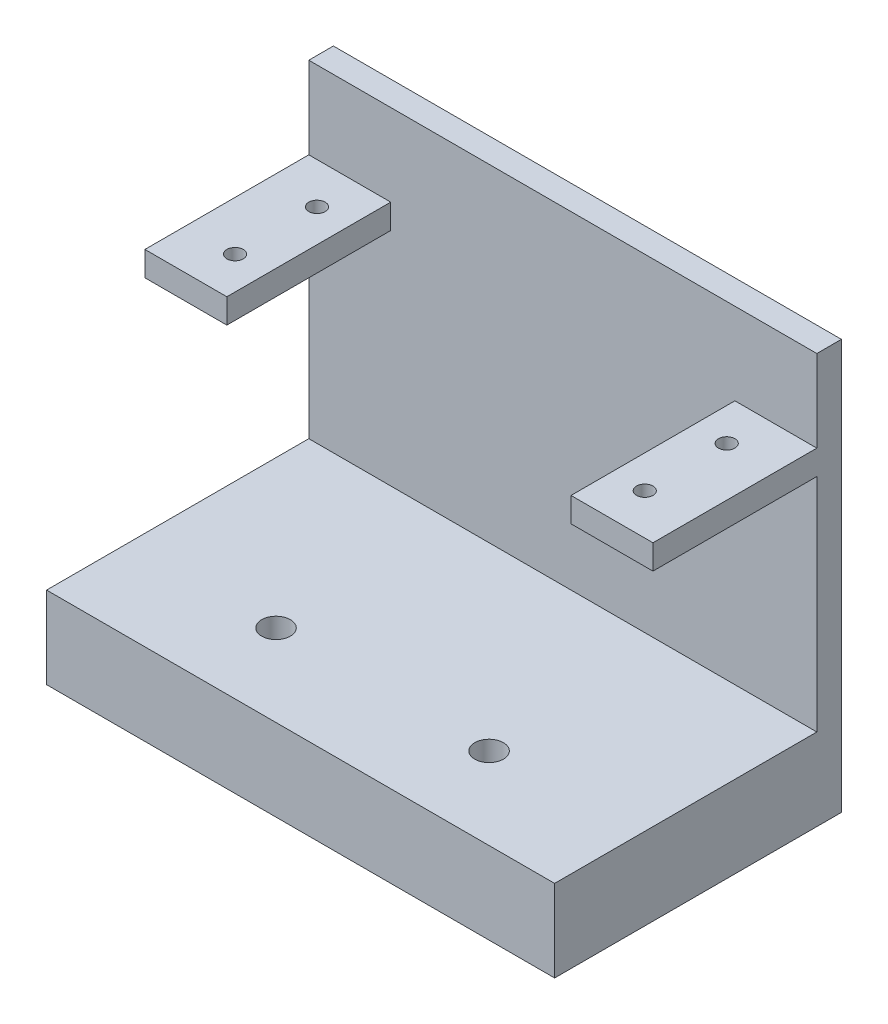
ISO-10303-21;
HEADER;
FILE_DESCRIPTION(('STEP AP214'),'2;1');
FILE_NAME('part.step','',(''),(''),'','','');
FILE_SCHEMA(('AUTOMOTIVE_DESIGN { 1 0 10303 214 1 1 1 1 }'));
ENDSEC;
DATA;
#1=APPLICATION_CONTEXT('core data for automotive mechanical design processes');
#2=APPLICATION_PROTOCOL_DEFINITION('international standard','automotive_design',2000,#1);
#3=PRODUCT_CONTEXT('',#1,'mechanical');
#4=PRODUCT('Part','Part','',(#3));
#5=PRODUCT_RELATED_PRODUCT_CATEGORY('part','',(#4));
#6=PRODUCT_DEFINITION_FORMATION('','',#4);
#7=PRODUCT_DEFINITION_CONTEXT('part definition',#1,'design');
#8=PRODUCT_DEFINITION('design','',#6,#7);
#9=PRODUCT_DEFINITION_SHAPE('','',#8);
#10=(LENGTH_UNIT() NAMED_UNIT(*) SI_UNIT(.MILLI.,.METRE.));
#11=(NAMED_UNIT(*) PLANE_ANGLE_UNIT() SI_UNIT($,.RADIAN.));
#12=(NAMED_UNIT(*) SI_UNIT($,.STERADIAN.) SOLID_ANGLE_UNIT());
#13=UNCERTAINTY_MEASURE_WITH_UNIT(LENGTH_MEASURE(1.E-05),#10,'distance_accuracy_value','');
#14=(GEOMETRIC_REPRESENTATION_CONTEXT(3) GLOBAL_UNCERTAINTY_ASSIGNED_CONTEXT((#13)) GLOBAL_UNIT_ASSIGNED_CONTEXT((#10,
#11,#12)) REPRESENTATION_CONTEXT('',''));
#15=CARTESIAN_POINT('',(0.,0.,0.));
#16=DIRECTION('',(0.,0.,1.));
#17=DIRECTION('',(1.,0.,0.));
#18=AXIS2_PLACEMENT_3D('',#15,#16,#17);
#19=CARTESIAN_POINT('',(0.,40.,-12.));
#20=DIRECTION('',(0.,-1.,0.));
#21=DIRECTION('',(0.,0.,-1.));
#22=AXIS2_PLACEMENT_3D('',#19,#20,#21);
#23=PLANE('',#22);
#24=CARTESIAN_POINT('',(6.,40.,-17.));
#25=DIRECTION('',(0.,1.,0.));
#26=DIRECTION('',(0.,0.,1.));
#27=AXIS2_PLACEMENT_3D('',#24,#25,#26);
#28=CIRCLE('',#27,1.);
#29=CARTESIAN_POINT('',(6.,40.,-16.));
#30=VERTEX_POINT('',#29);
#31=EDGE_CURVE('E280',#30,#30,#28,.T.);
#32=ORIENTED_EDGE('',*,*,#31,.F.);
#33=EDGE_LOOP('',(#32));
#34=FACE_BOUND('',#33,.T.);
#35=CARTESIAN_POINT('',(6.,40.,-27.));
#36=DIRECTION('',(0.,1.,0.));
#37=DIRECTION('',(0.,0.,1.));
#38=AXIS2_PLACEMENT_3D('',#35,#36,#37);
#39=CIRCLE('',#38,1.);
#40=CARTESIAN_POINT('',(6.,40.,-26.));
#41=VERTEX_POINT('',#40);
#42=EDGE_CURVE('E274',#41,#41,#39,.T.);
#43=ORIENTED_EDGE('',*,*,#42,.F.);
#44=EDGE_LOOP('',(#43));
#45=FACE_BOUND('',#44,.T.);
#46=DIRECTION('',(0.,0.,1.));
#47=VECTOR('',#46,1.);
#48=CARTESIAN_POINT('',(10.,40.,-12.));
#49=LINE('',#48,#47);
#50=CARTESIAN_POINT('',(10.,40.,-32.));
#51=VERTEX_POINT('',#50);
#52=CARTESIAN_POINT('',(10.,40.,-12.));
#53=VERTEX_POINT('',#52);
#54=EDGE_CURVE('E134',#51,#53,#49,.T.);
#55=ORIENTED_EDGE('',*,*,#54,.F.);
#56=DIRECTION('',(1.,0.,0.));
#57=VECTOR('',#56,1.);
#58=CARTESIAN_POINT('',(0.,40.,-32.));
#59=LINE('',#58,#57);
#60=CARTESIAN_POINT('',(0.,40.,-32.));
#61=VERTEX_POINT('',#60);
#62=EDGE_CURVE('E145',#61,#51,#59,.T.);
#63=ORIENTED_EDGE('',*,*,#62,.F.);
#64=DIRECTION('',(0.,0.,-1.));
#65=VECTOR('',#64,1.);
#66=CARTESIAN_POINT('',(0.,40.,-12.));
#67=LINE('',#66,#65);
#68=CARTESIAN_POINT('',(0.,40.,-12.));
#69=VERTEX_POINT('',#68);
#70=EDGE_CURVE('E241',#69,#61,#67,.T.);
#71=ORIENTED_EDGE('',*,*,#70,.F.);
#72=DIRECTION('',(1.,0.,0.));
#73=VECTOR('',#72,1.);
#74=CARTESIAN_POINT('',(0.,40.,-12.));
#75=LINE('',#74,#73);
#76=EDGE_CURVE('E147',#69,#53,#75,.T.);
#77=ORIENTED_EDGE('',*,*,#76,.T.);
#78=EDGE_LOOP('',(#55,#63,#71,#77));
#79=FACE_BOUND('',#78,.T.);
#80=ADVANCED_FACE('F34',(#34,#45,#79),#23,.F.);
#81=CARTESIAN_POINT('',(56.,40.,-27.));
#82=DIRECTION('',(0.,1.,0.));
#83=DIRECTION('',(0.,0.,1.));
#84=AXIS2_PLACEMENT_3D('',#81,#82,#83);
#85=CIRCLE('',#84,0.999999999999998);
#86=CARTESIAN_POINT('',(56.,40.,-26.));
#87=VERTEX_POINT('',#86);
#88=EDGE_CURVE('E292',#87,#87,#85,.T.);
#89=ORIENTED_EDGE('',*,*,#88,.F.);
#90=EDGE_LOOP('',(#89));
#91=FACE_BOUND('',#90,.T.);
#92=CARTESIAN_POINT('',(56.,40.,-17.));
#93=DIRECTION('',(0.,1.,0.));
#94=DIRECTION('',(0.,0.,1.));
#95=AXIS2_PLACEMENT_3D('',#92,#93,#94);
#96=CIRCLE('',#95,0.999999999999998);
#97=CARTESIAN_POINT('',(56.,40.,-16.));
#98=VERTEX_POINT('',#97);
#99=EDGE_CURVE('E286',#98,#98,#96,.T.);
#100=ORIENTED_EDGE('',*,*,#99,.F.);
#101=EDGE_LOOP('',(#100));
#102=FACE_BOUND('',#101,.T.);
#103=DIRECTION('',(0.,0.,-1.));
#104=VECTOR('',#103,1.);
#105=CARTESIAN_POINT('',(52.,40.,-12.));
#106=LINE('',#105,#104);
#107=CARTESIAN_POINT('',(52.,40.,-12.));
#108=VERTEX_POINT('',#107);
#109=CARTESIAN_POINT('',(52.,40.,-32.));
#110=VERTEX_POINT('',#109);
#111=EDGE_CURVE('E252',#108,#110,#106,.T.);
#112=ORIENTED_EDGE('',*,*,#111,.F.);
#113=CARTESIAN_POINT('',(62.,40.,-12.));
#114=VERTEX_POINT('',#113);
#115=EDGE_CURVE('E161',#108,#114,#75,.T.);
#116=ORIENTED_EDGE('',*,*,#115,.T.);
#117=DIRECTION('',(0.,0.,-1.));
#118=VECTOR('',#117,1.);
#119=CARTESIAN_POINT('',(62.,40.,-12.));
#120=LINE('',#119,#118);
#121=CARTESIAN_POINT('',(62.,40.,-32.));
#122=VERTEX_POINT('',#121);
#123=EDGE_CURVE('E223',#114,#122,#120,.T.);
#124=ORIENTED_EDGE('',*,*,#123,.T.);
#125=EDGE_CURVE('E154',#110,#122,#59,.T.);
#126=ORIENTED_EDGE('',*,*,#125,.F.);
#127=EDGE_LOOP('',(#112,#116,#124,#126));
#128=FACE_BOUND('',#127,.T.);
#129=ADVANCED_FACE('F321',(#91,#102,#128),#23,.F.);
#130=CARTESIAN_POINT('',(0.,37.,-12.));
#131=DIRECTION('',(0.,0.,-1.));
#132=DIRECTION('',(-1.,0.,0.));
#133=AXIS2_PLACEMENT_3D('',#130,#131,#132);
#134=PLANE('',#133);
#135=DIRECTION('',(0.,-1.,0.));
#136=VECTOR('',#135,1.);
#137=CARTESIAN_POINT('',(10.,50.,-12.));
#138=LINE('',#137,#136);
#139=CARTESIAN_POINT('',(10.,37.,-12.));
#140=VERTEX_POINT('',#139);
#141=EDGE_CURVE('E256',#53,#140,#138,.T.);
#142=ORIENTED_EDGE('',*,*,#141,.F.);
#143=ORIENTED_EDGE('',*,*,#76,.F.);
#144=DIRECTION('',(0.,1.,0.));
#145=VECTOR('',#144,1.);
#146=CARTESIAN_POINT('',(0.,37.,-12.));
#147=LINE('',#146,#145);
#148=CARTESIAN_POINT('',(0.,37.,-12.));
#149=VERTEX_POINT('',#148);
#150=EDGE_CURVE('E243',#149,#69,#147,.T.);
#151=ORIENTED_EDGE('',*,*,#150,.F.);
#152=DIRECTION('',(1.,0.,0.));
#153=VECTOR('',#152,1.);
#154=CARTESIAN_POINT('',(0.,37.,-12.));
#155=LINE('',#154,#153);
#156=EDGE_CURVE('E162',#149,#140,#155,.T.);
#157=ORIENTED_EDGE('',*,*,#156,.T.);
#158=EDGE_LOOP('',(#142,#143,#151,#157));
#159=FACE_BOUND('',#158,.T.);
#160=ADVANCED_FACE('F323',(#159),#134,.F.);
#161=DIRECTION('',(0.,-1.,0.));
#162=VECTOR('',#161,1.);
#163=CARTESIAN_POINT('',(52.,50.,-12.));
#164=LINE('',#163,#162);
#165=CARTESIAN_POINT('',(52.,37.,-12.));
#166=VERTEX_POINT('',#165);
#167=EDGE_CURVE('E258',#108,#166,#164,.T.);
#168=ORIENTED_EDGE('',*,*,#167,.T.);
#169=CARTESIAN_POINT('',(62.,37.,-12.));
#170=VERTEX_POINT('',#169);
#171=EDGE_CURVE('E165',#166,#170,#155,.T.);
#172=ORIENTED_EDGE('',*,*,#171,.T.);
#173=DIRECTION('',(0.,1.,0.));
#174=VECTOR('',#173,1.);
#175=CARTESIAN_POINT('',(62.,37.,-12.));
#176=LINE('',#175,#174);
#177=EDGE_CURVE('E228',#170,#114,#176,.T.);
#178=ORIENTED_EDGE('',*,*,#177,.T.);
#179=ORIENTED_EDGE('',*,*,#115,.F.);
#180=EDGE_LOOP('',(#168,#172,#178,#179));
#181=FACE_BOUND('',#180,.T.);
#182=ADVANCED_FACE('F317',(#181),#134,.F.);
#183=CARTESIAN_POINT('',(0.,37.,-32.));
#184=DIRECTION('',(0.,1.,0.));
#185=DIRECTION('',(0.,0.,1.));
#186=AXIS2_PLACEMENT_3D('',#183,#184,#185);
#187=PLANE('',#186);
#188=CARTESIAN_POINT('',(6.,37.,-17.));
#189=DIRECTION('',(0.,1.,0.));
#190=DIRECTION('',(0.,0.,1.));
#191=AXIS2_PLACEMENT_3D('',#188,#189,#190);
#192=CIRCLE('',#191,1.);
#193=CARTESIAN_POINT('',(6.,37.,-16.));
#194=VERTEX_POINT('',#193);
#195=EDGE_CURVE('E277',#194,#194,#192,.F.);
#196=ORIENTED_EDGE('',*,*,#195,.F.);
#197=EDGE_LOOP('',(#196));
#198=FACE_BOUND('',#197,.T.);
#199=CARTESIAN_POINT('',(6.,37.,-27.));
#200=DIRECTION('',(0.,1.,0.));
#201=DIRECTION('',(0.,0.,1.));
#202=AXIS2_PLACEMENT_3D('',#199,#200,#201);
#203=CIRCLE('',#202,1.);
#204=CARTESIAN_POINT('',(6.,37.,-26.));
#205=VERTEX_POINT('',#204);
#206=EDGE_CURVE('E273',#205,#205,#203,.F.);
#207=ORIENTED_EDGE('',*,*,#206,.F.);
#208=EDGE_LOOP('',(#207));
#209=FACE_BOUND('',#208,.T.);
#210=DIRECTION('',(0.,0.,-1.));
#211=VECTOR('',#210,1.);
#212=CARTESIAN_POINT('',(10.,37.,-32.));
#213=LINE('',#212,#211);
#214=CARTESIAN_POINT('',(10.,37.,-32.));
#215=VERTEX_POINT('',#214);
#216=EDGE_CURVE('E137',#140,#215,#213,.T.);
#217=ORIENTED_EDGE('',*,*,#216,.F.);
#218=ORIENTED_EDGE('',*,*,#156,.F.);
#219=DIRECTION('',(0.,0.,1.));
#220=VECTOR('',#219,1.);
#221=CARTESIAN_POINT('',(0.,37.,-32.));
#222=LINE('',#221,#220);
#223=CARTESIAN_POINT('',(0.,37.,-32.));
#224=VERTEX_POINT('',#223);
#225=EDGE_CURVE('E246',#224,#149,#222,.T.);
#226=ORIENTED_EDGE('',*,*,#225,.F.);
#227=DIRECTION('',(1.,0.,0.));
#228=VECTOR('',#227,1.);
#229=CARTESIAN_POINT('',(0.,37.,-32.));
#230=LINE('',#229,#228);
#231=EDGE_CURVE('E166',#224,#215,#230,.T.);
#232=ORIENTED_EDGE('',*,*,#231,.T.);
#233=EDGE_LOOP('',(#217,#218,#226,#232));
#234=FACE_BOUND('',#233,.T.);
#235=ADVANCED_FACE('F303',(#198,#209,#234),#187,.F.);
#236=CARTESIAN_POINT('',(56.,37.,-27.));
#237=DIRECTION('',(0.,1.,0.));
#238=DIRECTION('',(0.,0.,1.));
#239=AXIS2_PLACEMENT_3D('',#236,#237,#238);
#240=CIRCLE('',#239,0.999999999999998);
#241=CARTESIAN_POINT('',(56.,37.,-26.));
#242=VERTEX_POINT('',#241);
#243=EDGE_CURVE('E289',#242,#242,#240,.F.);
#244=ORIENTED_EDGE('',*,*,#243,.F.);
#245=EDGE_LOOP('',(#244));
#246=FACE_BOUND('',#245,.T.);
#247=CARTESIAN_POINT('',(56.,37.,-17.));
#248=DIRECTION('',(0.,1.,0.));
#249=DIRECTION('',(0.,0.,1.));
#250=AXIS2_PLACEMENT_3D('',#247,#248,#249);
#251=CIRCLE('',#250,0.999999999999998);
#252=CARTESIAN_POINT('',(56.,37.,-16.));
#253=VERTEX_POINT('',#252);
#254=EDGE_CURVE('E283',#253,#253,#251,.F.);
#255=ORIENTED_EDGE('',*,*,#254,.F.);
#256=EDGE_LOOP('',(#255));
#257=FACE_BOUND('',#256,.T.);
#258=DIRECTION('',(0.,0.,1.));
#259=VECTOR('',#258,1.);
#260=CARTESIAN_POINT('',(52.,37.,-32.));
#261=LINE('',#260,#259);
#262=CARTESIAN_POINT('',(52.,37.,-32.));
#263=VERTEX_POINT('',#262);
#264=EDGE_CURVE('E254',#263,#166,#261,.T.);
#265=ORIENTED_EDGE('',*,*,#264,.F.);
#266=CARTESIAN_POINT('',(62.,37.,-32.));
#267=VERTEX_POINT('',#266);
#268=EDGE_CURVE('E168',#263,#267,#230,.T.);
#269=ORIENTED_EDGE('',*,*,#268,.T.);
#270=DIRECTION('',(0.,0.,1.));
#271=VECTOR('',#270,1.);
#272=CARTESIAN_POINT('',(62.,37.,-32.));
#273=LINE('',#272,#271);
#274=EDGE_CURVE('E233',#267,#170,#273,.T.);
#275=ORIENTED_EDGE('',*,*,#274,.T.);
#276=ORIENTED_EDGE('',*,*,#171,.F.);
#277=EDGE_LOOP('',(#265,#269,#275,#276));
#278=FACE_BOUND('',#277,.T.);
#279=ADVANCED_FACE('F300',(#246,#257,#278),#187,.F.);
#280=CARTESIAN_POINT('',(0.,50.,0.));
#281=DIRECTION('',(1.,0.,0.));
#282=DIRECTION('',(0.,0.,-1.));
#283=AXIS2_PLACEMENT_3D('',#280,#281,#282);
#284=PLANE('',#283);
#285=ORIENTED_EDGE('',*,*,#70,.T.);
#286=DIRECTION('',(0.,1.,0.));
#287=VECTOR('',#286,1.);
#288=CARTESIAN_POINT('',(0.,40.,-32.));
#289=LINE('',#288,#287);
#290=CARTESIAN_POINT('',(0.,50.,-32.));
#291=VERTEX_POINT('',#290);
#292=EDGE_CURVE('E152',#61,#291,#289,.T.);
#293=ORIENTED_EDGE('',*,*,#292,.T.);
#294=DIRECTION('',(0.,0.,1.));
#295=VECTOR('',#294,1.);
#296=CARTESIAN_POINT('',(0.,50.,0.));
#297=LINE('',#296,#295);
#298=CARTESIAN_POINT('',(0.,50.,-35.));
#299=VERTEX_POINT('',#298);
#300=EDGE_CURVE('E173',#299,#291,#297,.T.);
#301=ORIENTED_EDGE('',*,*,#300,.F.);
#302=DIRECTION('',(0.,-1.,0.));
#303=VECTOR('',#302,1.);
#304=CARTESIAN_POINT('',(0.,50.,-35.));
#305=LINE('',#304,#303);
#306=CARTESIAN_POINT('',(0.,0.,-35.));
#307=VERTEX_POINT('',#306);
#308=EDGE_CURVE('E180',#299,#307,#305,.T.);
#309=ORIENTED_EDGE('',*,*,#308,.T.);
#310=DIRECTION('',(0.,0.,1.));
#311=VECTOR('',#310,1.);
#312=CARTESIAN_POINT('',(0.,0.,0.));
#313=LINE('',#312,#311);
#314=CARTESIAN_POINT('',(0.,0.,0.));
#315=VERTEX_POINT('',#314);
#316=EDGE_CURVE('E156',#307,#315,#313,.T.);
#317=ORIENTED_EDGE('',*,*,#316,.T.);
#318=DIRECTION('',(0.,-1.,0.));
#319=VECTOR('',#318,1.);
#320=CARTESIAN_POINT('',(0.,50.,0.));
#321=LINE('',#320,#319);
#322=CARTESIAN_POINT('',(0.,10.,0.));
#323=VERTEX_POINT('',#322);
#324=EDGE_CURVE('E11',#323,#315,#321,.T.);
#325=ORIENTED_EDGE('',*,*,#324,.F.);
#326=DIRECTION('',(0.,0.,-1.));
#327=VECTOR('',#326,1.);
#328=CARTESIAN_POINT('',(0.,10.,0.));
#329=LINE('',#328,#327);
#330=CARTESIAN_POINT('',(0.,10.,-32.));
#331=VERTEX_POINT('',#330);
#332=EDGE_CURVE('E224',#323,#331,#329,.T.);
#333=ORIENTED_EDGE('',*,*,#332,.T.);
#334=DIRECTION('',(0.,1.,0.));
#335=VECTOR('',#334,1.);
#336=CARTESIAN_POINT('',(0.,37.,-32.));
#337=LINE('',#336,#335);
#338=EDGE_CURVE('E226',#331,#224,#337,.T.);
#339=ORIENTED_EDGE('',*,*,#338,.T.);
#340=ORIENTED_EDGE('',*,*,#225,.T.);
#341=ORIENTED_EDGE('',*,*,#150,.T.);
#342=EDGE_LOOP('',(#285,#293,#301,#309,#317,#325,#333,#339,#340,#341));
#343=FACE_BOUND('',#342,.T.);
#344=ADVANCED_FACE('F36',(#343),#284,.F.);
#345=CARTESIAN_POINT('',(0.,50.,0.));
#346=DIRECTION('',(0.,0.,-1.));
#347=DIRECTION('',(-1.,0.,0.));
#348=AXIS2_PLACEMENT_3D('',#345,#346,#347);
#349=PLANE('',#348);
#350=DIRECTION('',(0.,-1.,0.));
#351=VECTOR('',#350,1.);
#352=CARTESIAN_POINT('',(62.,50.,0.));
#353=LINE('',#352,#351);
#354=CARTESIAN_POINT('',(62.,10.,0.));
#355=VERTEX_POINT('',#354);
#356=CARTESIAN_POINT('',(62.,0.,0.));
#357=VERTEX_POINT('',#356);
#358=EDGE_CURVE('E42',#355,#357,#353,.T.);
#359=ORIENTED_EDGE('',*,*,#358,.F.);
#360=DIRECTION('',(1.,0.,0.));
#361=VECTOR('',#360,1.);
#362=CARTESIAN_POINT('',(0.,10.,0.));
#363=LINE('',#362,#361);
#364=EDGE_CURVE('E171',#323,#355,#363,.T.);
#365=ORIENTED_EDGE('',*,*,#364,.F.);
#366=ORIENTED_EDGE('',*,*,#324,.T.);
#367=DIRECTION('',(1.,0.,0.));
#368=VECTOR('',#367,1.);
#369=CARTESIAN_POINT('',(0.,0.,0.));
#370=LINE('',#369,#368);
#371=EDGE_CURVE('E183',#315,#357,#370,.T.);
#372=ORIENTED_EDGE('',*,*,#371,.T.);
#373=EDGE_LOOP('',(#359,#365,#366,#372));
#374=FACE_BOUND('',#373,.T.);
#375=ADVANCED_FACE('F205',(#374),#349,.F.);
#376=CARTESIAN_POINT('',(62.,50.,0.));
#377=DIRECTION('',(-1.,0.,0.));
#378=DIRECTION('',(0.,0.,1.));
#379=AXIS2_PLACEMENT_3D('',#376,#377,#378);
#380=PLANE('',#379);
#381=DIRECTION('',(0.,0.,-1.));
#382=VECTOR('',#381,1.);
#383=CARTESIAN_POINT('',(62.,50.,0.));
#384=LINE('',#383,#382);
#385=CARTESIAN_POINT('',(62.,50.,-32.));
#386=VERTEX_POINT('',#385);
#387=CARTESIAN_POINT('',(62.,50.,-35.));
#388=VERTEX_POINT('',#387);
#389=EDGE_CURVE('E175',#386,#388,#384,.T.);
#390=ORIENTED_EDGE('',*,*,#389,.F.);
#391=DIRECTION('',(0.,1.,0.));
#392=VECTOR('',#391,1.);
#393=CARTESIAN_POINT('',(62.,40.,-32.));
#394=LINE('',#393,#392);
#395=EDGE_CURVE('E220',#122,#386,#394,.T.);
#396=ORIENTED_EDGE('',*,*,#395,.F.);
#397=ORIENTED_EDGE('',*,*,#123,.F.);
#398=ORIENTED_EDGE('',*,*,#177,.F.);
#399=ORIENTED_EDGE('',*,*,#274,.F.);
#400=DIRECTION('',(0.,1.,0.));
#401=VECTOR('',#400,1.);
#402=CARTESIAN_POINT('',(62.,37.,-32.));
#403=LINE('',#402,#401);
#404=CARTESIAN_POINT('',(62.,10.,-32.));
#405=VERTEX_POINT('',#404);
#406=EDGE_CURVE('E236',#405,#267,#403,.T.);
#407=ORIENTED_EDGE('',*,*,#406,.F.);
#408=DIRECTION('',(0.,0.,-1.));
#409=VECTOR('',#408,1.);
#410=CARTESIAN_POINT('',(62.,10.,0.));
#411=LINE('',#410,#409);
#412=EDGE_CURVE('E148',#355,#405,#411,.T.);
#413=ORIENTED_EDGE('',*,*,#412,.F.);
#414=ORIENTED_EDGE('',*,*,#358,.T.);
#415=DIRECTION('',(0.,0.,-1.));
#416=VECTOR('',#415,1.);
#417=CARTESIAN_POINT('',(62.,0.,0.));
#418=LINE('',#417,#416);
#419=CARTESIAN_POINT('',(62.,0.,-35.));
#420=VERTEX_POINT('',#419);
#421=EDGE_CURVE('E186',#357,#420,#418,.T.);
#422=ORIENTED_EDGE('',*,*,#421,.T.);
#423=DIRECTION('',(0.,-1.,0.));
#424=VECTOR('',#423,1.);
#425=CARTESIAN_POINT('',(62.,50.,-35.));
#426=LINE('',#425,#424);
#427=EDGE_CURVE('E191',#388,#420,#426,.T.);
#428=ORIENTED_EDGE('',*,*,#427,.F.);
#429=EDGE_LOOP('',(#390,#396,#397,#398,#399,#407,#413,#414,#422,#428));
#430=FACE_BOUND('',#429,.T.);
#431=ADVANCED_FACE('F197',(#430),#380,.F.);
#432=CARTESIAN_POINT('',(0.,50.,-35.));
#433=DIRECTION('',(0.,0.,1.));
#434=DIRECTION('',(1.,0.,0.));
#435=AXIS2_PLACEMENT_3D('',#432,#433,#434);
#436=PLANE('',#435);
#437=DIRECTION('',(-1.,0.,0.));
#438=VECTOR('',#437,1.);
#439=CARTESIAN_POINT('',(0.,0.,-35.));
#440=LINE('',#439,#438);
#441=EDGE_CURVE('E176',#420,#307,#440,.T.);
#442=ORIENTED_EDGE('',*,*,#441,.T.);
#443=ORIENTED_EDGE('',*,*,#308,.F.);
#444=DIRECTION('',(-1.,0.,0.));
#445=VECTOR('',#444,1.);
#446=CARTESIAN_POINT('',(0.,50.,-35.));
#447=LINE('',#446,#445);
#448=EDGE_CURVE('E178',#388,#299,#447,.T.);
#449=ORIENTED_EDGE('',*,*,#448,.F.);
#450=ORIENTED_EDGE('',*,*,#427,.T.);
#451=EDGE_LOOP('',(#442,#443,#449,#450));
#452=FACE_BOUND('',#451,.T.);
#453=ADVANCED_FACE('F213',(#452),#436,.F.);
#454=CARTESIAN_POINT('',(0.,50.,-35.));
#455=DIRECTION('',(0.,-1.,0.));
#456=DIRECTION('',(0.,0.,-1.));
#457=AXIS2_PLACEMENT_3D('',#454,#455,#456);
#458=PLANE('',#457);
#459=ORIENTED_EDGE('',*,*,#300,.T.);
#460=DIRECTION('',(1.,0.,0.));
#461=VECTOR('',#460,1.);
#462=CARTESIAN_POINT('',(0.,50.,-32.));
#463=LINE('',#462,#461);
#464=EDGE_CURVE('E57',#291,#386,#463,.T.);
#465=ORIENTED_EDGE('',*,*,#464,.T.);
#466=ORIENTED_EDGE('',*,*,#389,.T.);
#467=ORIENTED_EDGE('',*,*,#448,.T.);
#468=EDGE_LOOP('',(#459,#465,#466,#467));
#469=FACE_BOUND('',#468,.T.);
#470=ADVANCED_FACE('F217',(#469),#458,.F.);
#471=CARTESIAN_POINT('',(0.,0.,-35.));
#472=DIRECTION('',(0.,-1.,0.));
#473=DIRECTION('',(0.,0.,-1.));
#474=AXIS2_PLACEMENT_3D('',#471,#472,#473);
#475=PLANE('',#474);
#476=CARTESIAN_POINT('',(44.,0.,-10.));
#477=DIRECTION('',(0.,-1.,0.));
#478=DIRECTION('',(0.,0.,-1.));
#479=AXIS2_PLACEMENT_3D('',#476,#477,#478);
#480=CIRCLE('',#479,1.75);
#481=CARTESIAN_POINT('',(44.,0.,-8.25));
#482=VERTEX_POINT('',#481);
#483=EDGE_CURVE('E267',#482,#482,#480,.T.);
#484=ORIENTED_EDGE('',*,*,#483,.F.);
#485=EDGE_LOOP('',(#484));
#486=FACE_BOUND('',#485,.T.);
#487=CARTESIAN_POINT('',(18.,0.,-10.));
#488=DIRECTION('',(0.,-1.,0.));
#489=DIRECTION('',(0.,0.,-1.));
#490=AXIS2_PLACEMENT_3D('',#487,#488,#489);
#491=CIRCLE('',#490,1.75);
#492=CARTESIAN_POINT('',(18.,0.,-8.25));
#493=VERTEX_POINT('',#492);
#494=EDGE_CURVE('E140',#493,#493,#491,.T.);
#495=ORIENTED_EDGE('',*,*,#494,.F.);
#496=EDGE_LOOP('',(#495));
#497=FACE_BOUND('',#496,.T.);
#498=ORIENTED_EDGE('',*,*,#316,.F.);
#499=ORIENTED_EDGE('',*,*,#441,.F.);
#500=ORIENTED_EDGE('',*,*,#421,.F.);
#501=ORIENTED_EDGE('',*,*,#371,.F.);
#502=EDGE_LOOP('',(#498,#499,#500,#501));
#503=FACE_BOUND('',#502,.T.);
#504=ADVANCED_FACE('F210',(#486,#497,#503),#475,.T.);
#505=CARTESIAN_POINT('',(0.,40.,-32.));
#506=DIRECTION('',(0.,0.,-1.));
#507=DIRECTION('',(-1.,0.,0.));
#508=AXIS2_PLACEMENT_3D('',#505,#506,#507);
#509=PLANE('',#508);
#510=ORIENTED_EDGE('',*,*,#395,.T.);
#511=ORIENTED_EDGE('',*,*,#464,.F.);
#512=ORIENTED_EDGE('',*,*,#292,.F.);
#513=ORIENTED_EDGE('',*,*,#62,.T.);
#514=DIRECTION('',(0.,-1.,0.));
#515=VECTOR('',#514,1.);
#516=CARTESIAN_POINT('',(10.,50.,-32.));
#517=LINE('',#516,#515);
#518=EDGE_CURVE('E49',#51,#215,#517,.T.);
#519=ORIENTED_EDGE('',*,*,#518,.T.);
#520=ORIENTED_EDGE('',*,*,#231,.F.);
#521=ORIENTED_EDGE('',*,*,#338,.F.);
#522=DIRECTION('',(1.,0.,0.));
#523=VECTOR('',#522,1.);
#524=CARTESIAN_POINT('',(0.,10.,-32.));
#525=LINE('',#524,#523);
#526=EDGE_CURVE('E169',#331,#405,#525,.T.);
#527=ORIENTED_EDGE('',*,*,#526,.T.);
#528=ORIENTED_EDGE('',*,*,#406,.T.);
#529=ORIENTED_EDGE('',*,*,#268,.F.);
#530=DIRECTION('',(0.,-1.,0.));
#531=VECTOR('',#530,1.);
#532=CARTESIAN_POINT('',(52.,50.,-32.));
#533=LINE('',#532,#531);
#534=EDGE_CURVE('E139',#110,#263,#533,.T.);
#535=ORIENTED_EDGE('',*,*,#534,.F.);
#536=ORIENTED_EDGE('',*,*,#125,.T.);
#537=EDGE_LOOP('',(#510,#511,#512,#513,#519,#520,#521,#527,#528,#529,#535,#536));
#538=FACE_BOUND('',#537,.T.);
#539=ADVANCED_FACE('F150',(#538),#509,.F.);
#540=CARTESIAN_POINT('',(0.,10.,0.));
#541=DIRECTION('',(0.,-1.,0.));
#542=DIRECTION('',(0.,0.,-1.));
#543=AXIS2_PLACEMENT_3D('',#540,#541,#542);
#544=PLANE('',#543);
#545=CARTESIAN_POINT('',(44.,10.,-10.));
#546=DIRECTION('',(0.,1.,0.));
#547=DIRECTION('',(0.,0.,1.));
#548=AXIS2_PLACEMENT_3D('',#545,#546,#547);
#549=CIRCLE('',#548,1.75);
#550=CARTESIAN_POINT('',(44.,9.99999999999999,-8.25));
#551=VERTEX_POINT('',#550);
#552=EDGE_CURVE('E270',#551,#551,#549,.T.);
#553=ORIENTED_EDGE('',*,*,#552,.F.);
#554=EDGE_LOOP('',(#553));
#555=FACE_BOUND('',#554,.T.);
#556=CARTESIAN_POINT('',(18.,10.,-10.));
#557=DIRECTION('',(0.,1.,0.));
#558=DIRECTION('',(0.,0.,1.));
#559=AXIS2_PLACEMENT_3D('',#556,#557,#558);
#560=CIRCLE('',#559,1.75);
#561=CARTESIAN_POINT('',(18.,9.99999999999999,-8.25));
#562=VERTEX_POINT('',#561);
#563=EDGE_CURVE('E264',#562,#562,#560,.T.);
#564=ORIENTED_EDGE('',*,*,#563,.F.);
#565=EDGE_LOOP('',(#564));
#566=FACE_BOUND('',#565,.T.);
#567=ORIENTED_EDGE('',*,*,#412,.T.);
#568=ORIENTED_EDGE('',*,*,#526,.F.);
#569=ORIENTED_EDGE('',*,*,#332,.F.);
#570=ORIENTED_EDGE('',*,*,#364,.T.);
#571=EDGE_LOOP('',(#567,#568,#569,#570));
#572=FACE_BOUND('',#571,.T.);
#573=ADVANCED_FACE('F340',(#555,#566,#572),#544,.F.);
#574=CARTESIAN_POINT('',(10.,50.,-12.));
#575=DIRECTION('',(1.,0.,0.));
#576=DIRECTION('',(0.,0.,-1.));
#577=AXIS2_PLACEMENT_3D('',#574,#575,#576);
#578=PLANE('',#577);
#579=ORIENTED_EDGE('',*,*,#54,.T.);
#580=ORIENTED_EDGE('',*,*,#141,.T.);
#581=ORIENTED_EDGE('',*,*,#216,.T.);
#582=ORIENTED_EDGE('',*,*,#518,.F.);
#583=EDGE_LOOP('',(#579,#580,#581,#582));
#584=FACE_BOUND('',#583,.T.);
#585=ADVANCED_FACE('F133',(#584),#578,.T.);
#586=CARTESIAN_POINT('',(52.,50.,-12.));
#587=DIRECTION('',(-1.,0.,0.));
#588=DIRECTION('',(0.,0.,1.));
#589=AXIS2_PLACEMENT_3D('',#586,#587,#588);
#590=PLANE('',#589);
#591=ORIENTED_EDGE('',*,*,#111,.T.);
#592=ORIENTED_EDGE('',*,*,#534,.T.);
#593=ORIENTED_EDGE('',*,*,#264,.T.);
#594=ORIENTED_EDGE('',*,*,#167,.F.);
#595=EDGE_LOOP('',(#591,#592,#593,#594));
#596=FACE_BOUND('',#595,.T.);
#597=ADVANCED_FACE('F319',(#596),#590,.T.);
#598=CARTESIAN_POINT('',(18.,-90.,-9.99999999999999));
#599=DIRECTION('',(0.,1.,0.));
#600=DIRECTION('',(0.,0.,1.));
#601=AXIS2_PLACEMENT_3D('',#598,#599,#600);
#602=CYLINDRICAL_SURFACE('',#601,1.75);
#603=CARTESIAN_POINT('',(18.,0.,-8.25));
#604=CARTESIAN_POINT('',(18.,0.104166666666678,-8.25));
#605=CARTESIAN_POINT('',(18.,0.208333333333343,-8.25));
#606=CARTESIAN_POINT('',(18.,0.416666666666676,-8.25));
#607=CARTESIAN_POINT('',(18.,0.520833333333345,-8.25));
#608=CARTESIAN_POINT('',(18.,0.729166666666679,-8.25));
#609=CARTESIAN_POINT('',(18.,0.833333333333343,-8.25));
#610=CARTESIAN_POINT('',(18.,1.04166666666668,-8.25));
#611=CARTESIAN_POINT('',(18.,1.14583333333335,-8.25));
#612=CARTESIAN_POINT('',(18.,1.35416666666668,-8.25));
#613=CARTESIAN_POINT('',(18.,1.45833333333334,-8.25));
#614=CARTESIAN_POINT('',(18.,1.66666666666668,-8.25));
#615=CARTESIAN_POINT('',(18.,1.77083333333335,-8.25));
#616=CARTESIAN_POINT('',(18.,1.97916666666668,-8.25));
#617=CARTESIAN_POINT('',(18.,2.08333333333334,-8.25));
#618=CARTESIAN_POINT('',(18.,2.29166666666668,-8.25));
#619=CARTESIAN_POINT('',(18.,2.39583333333335,-8.25));
#620=CARTESIAN_POINT('',(18.,2.60416666666668,-8.25));
#621=CARTESIAN_POINT('',(18.,2.70833333333335,-8.25));
#622=CARTESIAN_POINT('',(18.,2.91666666666667,-8.25));
#623=CARTESIAN_POINT('',(18.,3.02083333333334,-8.25));
#624=CARTESIAN_POINT('',(18.,3.22916666666667,-8.25));
#625=CARTESIAN_POINT('',(18.,3.33333333333334,-8.25));
#626=CARTESIAN_POINT('',(18.,3.54166666666667,-8.25));
#627=CARTESIAN_POINT('',(18.,3.64583333333334,-8.25));
#628=CARTESIAN_POINT('',(18.,3.85416666666667,-8.25));
#629=CARTESIAN_POINT('',(18.,3.95833333333334,-8.25));
#630=CARTESIAN_POINT('',(18.,4.16666666666667,-8.25));
#631=CARTESIAN_POINT('',(18.,4.27083333333334,-8.25));
#632=CARTESIAN_POINT('',(18.,4.47916666666667,-8.25));
#633=CARTESIAN_POINT('',(18.,4.58333333333334,-8.25));
#634=CARTESIAN_POINT('',(18.,4.79166666666668,-8.25));
#635=CARTESIAN_POINT('',(18.,4.89583333333334,-8.25));
#636=CARTESIAN_POINT('',(18.,5.10416666666667,-8.25));
#637=CARTESIAN_POINT('',(18.,5.20833333333333,-8.25));
#638=CARTESIAN_POINT('',(18.,5.41666666666667,-8.25));
#639=CARTESIAN_POINT('',(18.,5.52083333333334,-8.25));
#640=CARTESIAN_POINT('',(18.,5.72916666666667,-8.25));
#641=CARTESIAN_POINT('',(18.,5.83333333333333,-8.25));
#642=CARTESIAN_POINT('',(18.,6.04166666666667,-8.25));
#643=CARTESIAN_POINT('',(18.,6.14583333333334,-8.25));
#644=CARTESIAN_POINT('',(18.,6.35416666666667,-8.25));
#645=CARTESIAN_POINT('',(18.,6.45833333333333,-8.25));
#646=CARTESIAN_POINT('',(18.,6.66666666666667,-8.25));
#647=CARTESIAN_POINT('',(18.,6.77083333333334,-8.25));
#648=CARTESIAN_POINT('',(18.,6.97916666666667,-8.25));
#649=CARTESIAN_POINT('',(18.,7.08333333333333,-8.25));
#650=CARTESIAN_POINT('',(18.,7.29166666666666,-8.25));
#651=CARTESIAN_POINT('',(18.,7.39583333333333,-8.25));
#652=CARTESIAN_POINT('',(18.,7.60416666666666,-8.25));
#653=CARTESIAN_POINT('',(18.,7.70833333333333,-8.25));
#654=CARTESIAN_POINT('',(18.,7.91666666666666,-8.25));
#655=CARTESIAN_POINT('',(18.,8.02083333333333,-8.25));
#656=CARTESIAN_POINT('',(18.,8.22916666666666,-8.25));
#657=CARTESIAN_POINT('',(18.,8.33333333333333,-8.25));
#658=CARTESIAN_POINT('',(18.,8.54166666666666,-8.25));
#659=CARTESIAN_POINT('',(18.,8.64583333333333,-8.25));
#660=CARTESIAN_POINT('',(18.,8.85416666666666,-8.25));
#661=CARTESIAN_POINT('',(18.,8.95833333333333,-8.25));
#662=CARTESIAN_POINT('',(18.,9.16666666666666,-8.25));
#663=CARTESIAN_POINT('',(18.,9.27083333333333,-8.25));
#664=CARTESIAN_POINT('',(18.,9.47916666666666,-8.25));
#665=CARTESIAN_POINT('',(18.,9.58333333333333,-8.25));
#666=CARTESIAN_POINT('',(18.,9.79166666666667,-8.25));
#667=CARTESIAN_POINT('',(18.,9.89583333333333,-8.25));
#668=CARTESIAN_POINT('',(18.,9.99999999999999,-8.25));
#669=B_SPLINE_CURVE_WITH_KNOTS('',3,(#603,#604,#605,#606,#607,#608,#609,#610,#611,#612,#613,
#614,#615,#616,#617,#618,#619,#620,#621,#622,#623,#624,#625,#626,#627,#628,#629,#630,#631,#632,
#633,#634,#635,#636,#637,#638,#639,#640,#641,#642,#643,#644,#645,#646,#647,#648,#649,#650,#651,
#652,#653,#654,#655,#656,#657,#658,#659,#660,#661,#662,#663,#664,#665,#666,#667,#668),
.UNSPECIFIED.,.F.,.F.,(4,2,2,2,2,2,2,2,2,2,2,2,2,2,2,2,2,2,2,2,2,2,2,2,2,2,2,2,2,2,2,2,4),(0.,
0.312499999999993,0.625000000000001,0.937499999999994,1.25,1.56249999999999,1.875,2.1875,2.5,
2.8125,3.12499999999999,3.4375,3.74999999999999,4.0625,4.37499999999999,4.6875,4.99999999999999,
5.31249999999998,5.62499999999999,5.93749999999998,6.24999999999999,6.56249999999998,
6.87499999999999,7.18749999999999,7.49999999999998,7.81249999999999,8.12499999999998,
8.43749999999999,8.74999999999998,9.06249999999999,9.37499999999998,9.68749999999999,
9.99999999999998),.UNSPECIFIED.);
#670=EDGE_CURVE('BSEAM424',#493,#562,#669,.T.);
#671=ORIENTED_EDGE('',*,*,#494,.T.);
#672=ORIENTED_EDGE('',*,*,#563,.T.);
#673=ORIENTED_EDGE('',*,*,#670,.T.);
#674=ORIENTED_EDGE('',*,*,#670,.F.);
#675=EDGE_LOOP('',(#671,#673,#672,#674));
#676=FACE_BOUND('',#675,.T.);
#677=ADVANCED_FACE('F424',(#676),#602,.F.);
#678=CARTESIAN_POINT('',(44.,-90.,-9.99999999999999));
#679=DIRECTION('',(0.,1.,0.));
#680=DIRECTION('',(0.,0.,1.));
#681=AXIS2_PLACEMENT_3D('',#678,#679,#680);
#682=CYLINDRICAL_SURFACE('',#681,1.75);
#683=CARTESIAN_POINT('',(44.,0.,-8.25));
#684=CARTESIAN_POINT('',(44.,0.104166666666678,-8.25));
#685=CARTESIAN_POINT('',(44.,0.208333333333343,-8.25));
#686=CARTESIAN_POINT('',(44.,0.416666666666676,-8.25));
#687=CARTESIAN_POINT('',(44.,0.520833333333345,-8.25));
#688=CARTESIAN_POINT('',(44.,0.729166666666679,-8.25));
#689=CARTESIAN_POINT('',(44.,0.833333333333343,-8.25));
#690=CARTESIAN_POINT('',(44.,1.04166666666668,-8.25));
#691=CARTESIAN_POINT('',(44.,1.14583333333335,-8.25));
#692=CARTESIAN_POINT('',(44.,1.35416666666668,-8.25));
#693=CARTESIAN_POINT('',(44.,1.45833333333334,-8.25));
#694=CARTESIAN_POINT('',(44.,1.66666666666668,-8.25));
#695=CARTESIAN_POINT('',(44.,1.77083333333335,-8.25));
#696=CARTESIAN_POINT('',(44.,1.97916666666668,-8.25));
#697=CARTESIAN_POINT('',(44.,2.08333333333334,-8.25));
#698=CARTESIAN_POINT('',(44.,2.29166666666668,-8.25));
#699=CARTESIAN_POINT('',(44.,2.39583333333335,-8.25));
#700=CARTESIAN_POINT('',(44.,2.60416666666668,-8.25));
#701=CARTESIAN_POINT('',(44.,2.70833333333335,-8.25));
#702=CARTESIAN_POINT('',(44.,2.91666666666667,-8.25));
#703=CARTESIAN_POINT('',(44.,3.02083333333334,-8.25));
#704=CARTESIAN_POINT('',(44.,3.22916666666667,-8.25));
#705=CARTESIAN_POINT('',(44.,3.33333333333334,-8.25));
#706=CARTESIAN_POINT('',(44.,3.54166666666667,-8.25));
#707=CARTESIAN_POINT('',(44.,3.64583333333334,-8.25));
#708=CARTESIAN_POINT('',(44.,3.85416666666667,-8.25));
#709=CARTESIAN_POINT('',(44.,3.95833333333334,-8.25));
#710=CARTESIAN_POINT('',(44.,4.16666666666667,-8.25));
#711=CARTESIAN_POINT('',(44.,4.27083333333334,-8.25));
#712=CARTESIAN_POINT('',(44.,4.47916666666667,-8.25));
#713=CARTESIAN_POINT('',(44.,4.58333333333334,-8.25));
#714=CARTESIAN_POINT('',(44.,4.79166666666668,-8.25));
#715=CARTESIAN_POINT('',(44.,4.89583333333334,-8.25));
#716=CARTESIAN_POINT('',(44.,5.10416666666667,-8.25));
#717=CARTESIAN_POINT('',(44.,5.20833333333333,-8.25));
#718=CARTESIAN_POINT('',(44.,5.41666666666667,-8.25));
#719=CARTESIAN_POINT('',(44.,5.52083333333334,-8.25));
#720=CARTESIAN_POINT('',(44.,5.72916666666667,-8.25));
#721=CARTESIAN_POINT('',(44.,5.83333333333333,-8.25));
#722=CARTESIAN_POINT('',(44.,6.04166666666667,-8.25));
#723=CARTESIAN_POINT('',(44.,6.14583333333334,-8.25));
#724=CARTESIAN_POINT('',(44.,6.35416666666667,-8.25));
#725=CARTESIAN_POINT('',(44.,6.45833333333333,-8.25));
#726=CARTESIAN_POINT('',(44.,6.66666666666667,-8.25));
#727=CARTESIAN_POINT('',(44.,6.77083333333334,-8.25));
#728=CARTESIAN_POINT('',(44.,6.97916666666667,-8.25));
#729=CARTESIAN_POINT('',(44.,7.08333333333333,-8.25));
#730=CARTESIAN_POINT('',(44.,7.29166666666666,-8.25));
#731=CARTESIAN_POINT('',(44.,7.39583333333333,-8.25));
#732=CARTESIAN_POINT('',(44.,7.60416666666666,-8.25));
#733=CARTESIAN_POINT('',(44.,7.70833333333333,-8.25));
#734=CARTESIAN_POINT('',(44.,7.91666666666666,-8.25));
#735=CARTESIAN_POINT('',(44.,8.02083333333333,-8.25));
#736=CARTESIAN_POINT('',(44.,8.22916666666666,-8.25));
#737=CARTESIAN_POINT('',(44.,8.33333333333333,-8.25));
#738=CARTESIAN_POINT('',(44.,8.54166666666666,-8.25));
#739=CARTESIAN_POINT('',(44.,8.64583333333333,-8.25));
#740=CARTESIAN_POINT('',(44.,8.85416666666666,-8.25));
#741=CARTESIAN_POINT('',(44.,8.95833333333333,-8.25));
#742=CARTESIAN_POINT('',(44.,9.16666666666666,-8.25));
#743=CARTESIAN_POINT('',(44.,9.27083333333333,-8.25));
#744=CARTESIAN_POINT('',(44.,9.47916666666666,-8.25));
#745=CARTESIAN_POINT('',(44.,9.58333333333333,-8.25));
#746=CARTESIAN_POINT('',(44.,9.79166666666667,-8.25));
#747=CARTESIAN_POINT('',(44.,9.89583333333333,-8.25));
#748=CARTESIAN_POINT('',(44.,9.99999999999999,-8.25));
#749=B_SPLINE_CURVE_WITH_KNOTS('',3,(#683,#684,#685,#686,#687,#688,#689,#690,#691,#692,#693,
#694,#695,#696,#697,#698,#699,#700,#701,#702,#703,#704,#705,#706,#707,#708,#709,#710,#711,#712,
#713,#714,#715,#716,#717,#718,#719,#720,#721,#722,#723,#724,#725,#726,#727,#728,#729,#730,#731,
#732,#733,#734,#735,#736,#737,#738,#739,#740,#741,#742,#743,#744,#745,#746,#747,#748),
.UNSPECIFIED.,.F.,.F.,(4,2,2,2,2,2,2,2,2,2,2,2,2,2,2,2,2,2,2,2,2,2,2,2,2,2,2,2,2,2,2,2,4),(0.,
0.312499999999993,0.625000000000001,0.937499999999994,1.25,1.56249999999999,1.875,2.1875,2.5,
2.8125,3.12499999999999,3.4375,3.74999999999999,4.0625,4.37499999999999,4.6875,4.99999999999999,
5.31249999999998,5.62499999999999,5.93749999999998,6.24999999999999,6.56249999999998,
6.87499999999999,7.18749999999999,7.49999999999998,7.81249999999999,8.12499999999998,
8.43749999999999,8.74999999999998,9.06249999999999,9.37499999999998,9.68749999999999,
9.99999999999998),.UNSPECIFIED.);
#750=EDGE_CURVE('BSEAM430',#482,#551,#749,.T.);
#751=ORIENTED_EDGE('',*,*,#483,.T.);
#752=ORIENTED_EDGE('',*,*,#552,.T.);
#753=ORIENTED_EDGE('',*,*,#750,.T.);
#754=ORIENTED_EDGE('',*,*,#750,.F.);
#755=EDGE_LOOP('',(#751,#753,#752,#754));
#756=FACE_BOUND('',#755,.T.);
#757=ADVANCED_FACE('F430',(#756),#682,.F.);
#758=CARTESIAN_POINT('',(6.,-0.001000000000001,-27.));
#759=DIRECTION('',(0.,1.,0.));
#760=DIRECTION('',(0.,0.,1.));
#761=AXIS2_PLACEMENT_3D('',#758,#759,#760);
#762=CYLINDRICAL_SURFACE('',#761,1.);
#763=ORIENTED_EDGE('',*,*,#42,.T.);
#764=EDGE_LOOP('',(#763));
#765=FACE_BOUND('',#764,.T.);
#766=ORIENTED_EDGE('',*,*,#206,.T.);
#767=EDGE_LOOP('',(#766));
#768=FACE_BOUND('',#767,.T.);
#769=ADVANCED_FACE('F438',(#765,#768),#762,.F.);
#770=CARTESIAN_POINT('',(6.,-0.001000000000001,-17.));
#771=DIRECTION('',(0.,1.,0.));
#772=DIRECTION('',(0.,0.,1.));
#773=AXIS2_PLACEMENT_3D('',#770,#771,#772);
#774=CYLINDRICAL_SURFACE('',#773,1.);
#775=ORIENTED_EDGE('',*,*,#31,.T.);
#776=EDGE_LOOP('',(#775));
#777=FACE_BOUND('',#776,.T.);
#778=ORIENTED_EDGE('',*,*,#195,.T.);
#779=EDGE_LOOP('',(#778));
#780=FACE_BOUND('',#779,.T.);
#781=ADVANCED_FACE('F446',(#777,#780),#774,.F.);
#782=CARTESIAN_POINT('',(56.,-0.001000000000001,-17.));
#783=DIRECTION('',(0.,1.,0.));
#784=DIRECTION('',(0.,0.,1.));
#785=AXIS2_PLACEMENT_3D('',#782,#783,#784);
#786=CYLINDRICAL_SURFACE('',#785,0.999999999999998);
#787=ORIENTED_EDGE('',*,*,#99,.T.);
#788=EDGE_LOOP('',(#787));
#789=FACE_BOUND('',#788,.T.);
#790=ORIENTED_EDGE('',*,*,#254,.T.);
#791=EDGE_LOOP('',(#790));
#792=FACE_BOUND('',#791,.T.);
#793=ADVANCED_FACE('F454',(#789,#792),#786,.F.);
#794=CARTESIAN_POINT('',(56.,-0.001000000000001,-27.));
#795=DIRECTION('',(0.,1.,0.));
#796=DIRECTION('',(0.,0.,1.));
#797=AXIS2_PLACEMENT_3D('',#794,#795,#796);
#798=CYLINDRICAL_SURFACE('',#797,0.999999999999998);
#799=ORIENTED_EDGE('',*,*,#88,.T.);
#800=EDGE_LOOP('',(#799));
#801=FACE_BOUND('',#800,.T.);
#802=ORIENTED_EDGE('',*,*,#243,.T.);
#803=EDGE_LOOP('',(#802));
#804=FACE_BOUND('',#803,.T.);
#805=ADVANCED_FACE('F298',(#801,#804),#798,.F.);
#806=CLOSED_SHELL('',(#80,#129,#160,#182,#235,#279,#344,#375,#431,#453,#470,#504,#539,#573,#585,
#597,#677,#757,#769,#781,#793,#805));
#807=MANIFOLD_SOLID_BREP('B2',#806);
#808=ADVANCED_BREP_SHAPE_REPRESENTATION('',(#18,#807),#14);
#809=SHAPE_DEFINITION_REPRESENTATION(#9,#808);
ENDSEC;
END-ISO-10303-21;
